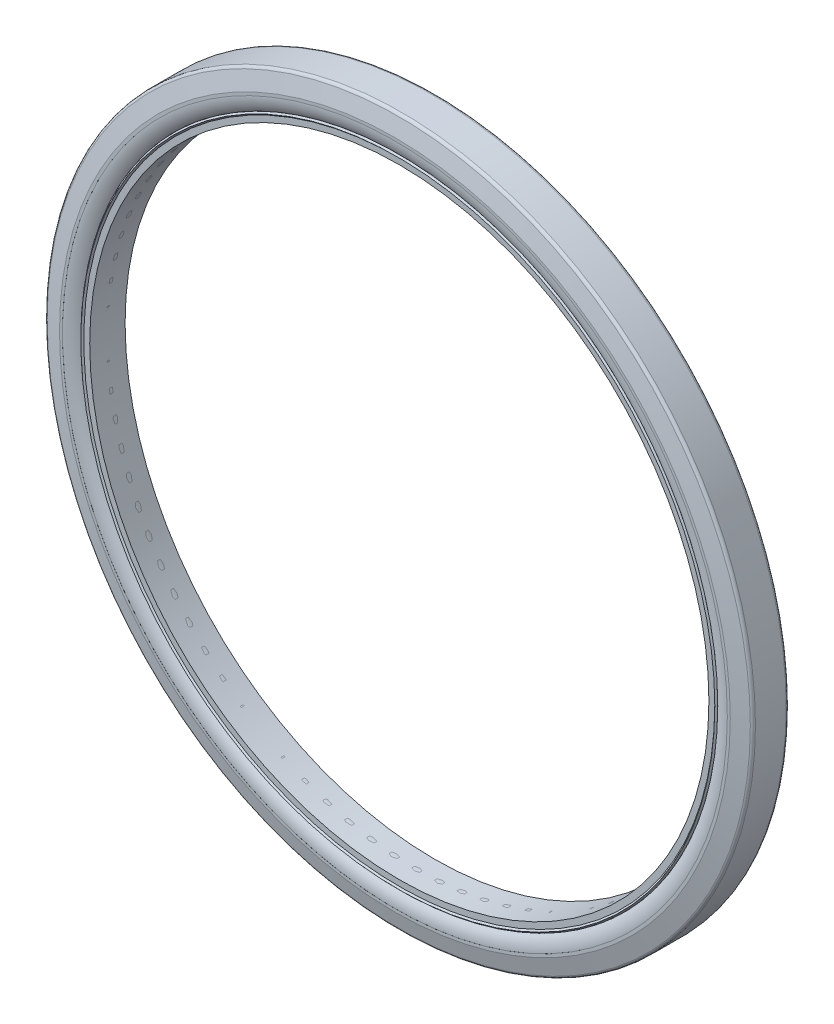
ISO-10303-21;
HEADER;
FILE_DESCRIPTION(('STEP AP214'),'2;1');
FILE_NAME('part.step','',(''),(''),'','','');
FILE_SCHEMA(('AUTOMOTIVE_DESIGN { 1 0 10303 214 1 1 1 1 }'));
ENDSEC;
DATA;
#1=APPLICATION_CONTEXT('core data for automotive mechanical design processes');
#2=APPLICATION_PROTOCOL_DEFINITION('international standard','automotive_design',2000,#1);
#3=PRODUCT_CONTEXT('',#1,'mechanical');
#4=PRODUCT('Part','Part','',(#3));
#5=PRODUCT_RELATED_PRODUCT_CATEGORY('part','',(#4));
#6=PRODUCT_DEFINITION_FORMATION('','',#4);
#7=PRODUCT_DEFINITION_CONTEXT('part definition',#1,'design');
#8=PRODUCT_DEFINITION('design','',#6,#7);
#9=PRODUCT_DEFINITION_SHAPE('','',#8);
#10=(LENGTH_UNIT() NAMED_UNIT(*) SI_UNIT(.MILLI.,.METRE.));
#11=(NAMED_UNIT(*) PLANE_ANGLE_UNIT() SI_UNIT($,.RADIAN.));
#12=(NAMED_UNIT(*) SI_UNIT($,.STERADIAN.) SOLID_ANGLE_UNIT());
#13=UNCERTAINTY_MEASURE_WITH_UNIT(LENGTH_MEASURE(1.E-05),#10,'distance_accuracy_value','');
#14=(GEOMETRIC_REPRESENTATION_CONTEXT(3) GLOBAL_UNCERTAINTY_ASSIGNED_CONTEXT((#13)) GLOBAL_UNIT_ASSIGNED_CONTEXT((#10,
#11,#12)) REPRESENTATION_CONTEXT('',''));
#15=CARTESIAN_POINT('',(0.,0.,0.));
#16=DIRECTION('',(0.,0.,1.));
#17=DIRECTION('',(1.,0.,0.));
#18=AXIS2_PLACEMENT_3D('',#15,#16,#17);
#19=CARTESIAN_POINT('',(0.,22.55,1.2));
#20=DIRECTION('',(0.,0.,-1.));
#21=DIRECTION('',(-1.,0.,0.));
#22=AXIS2_PLACEMENT_3D('',#19,#20,#21);
#23=PLANE('',#22);
#24=CARTESIAN_POINT('',(0.,0.,1.2));
#25=DIRECTION('',(0.,0.,1.));
#26=DIRECTION('',(1.,0.,0.));
#27=AXIS2_PLACEMENT_3D('',#24,#25,#26);
#28=CIRCLE('',#27,21.6);
#29=CARTESIAN_POINT('',(21.6,0.,1.2));
#30=VERTEX_POINT('',#29);
#31=EDGE_CURVE('E109',#30,#30,#28,.T.);
#32=ORIENTED_EDGE('',*,*,#31,.F.);
#33=EDGE_LOOP('',(#32));
#34=FACE_BOUND('',#33,.T.);
#35=CARTESIAN_POINT('',(0.,0.,1.2));
#36=DIRECTION('',(0.,0.,1.));
#37=DIRECTION('',(1.,0.,0.));
#38=AXIS2_PLACEMENT_3D('',#35,#36,#37);
#39=CIRCLE('',#38,22.55);
#40=CARTESIAN_POINT('',(22.55,0.,1.2));
#41=VERTEX_POINT('',#40);
#42=EDGE_CURVE('E11',#41,#41,#39,.T.);
#43=ORIENTED_EDGE('',*,*,#42,.T.);
#44=EDGE_LOOP('',(#43));
#45=FACE_BOUND('',#44,.T.);
#46=ADVANCED_FACE('F51',(#34,#45),#23,.F.);
#47=CARTESIAN_POINT('',(0.,0.,0.));
#48=DIRECTION('',(0.,0.,1.));
#49=DIRECTION('',(1.,0.,0.));
#50=AXIS2_PLACEMENT_3D('',#47,#48,#49);
#51=CYLINDRICAL_SURFACE('',#50,22.55);
#52=ORIENTED_EDGE('',*,*,#42,.F.);
#53=EDGE_LOOP('',(#52));
#54=FACE_BOUND('',#53,.T.);
#55=CARTESIAN_POINT('',(0.,0.,1.5));
#56=DIRECTION('',(0.,0.,1.));
#57=DIRECTION('',(1.,0.,0.));
#58=AXIS2_PLACEMENT_3D('',#55,#56,#57);
#59=CIRCLE('',#58,22.55);
#60=CARTESIAN_POINT('',(22.55,0.,1.5));
#61=VERTEX_POINT('',#60);
#62=EDGE_CURVE('E57',#61,#61,#59,.T.);
#63=ORIENTED_EDGE('',*,*,#62,.T.);
#64=EDGE_LOOP('',(#63));
#65=FACE_BOUND('',#64,.T.);
#66=ADVANCED_FACE('F116',(#54,#65),#51,.F.);
#67=CARTESIAN_POINT('',(0.,22.75,1.5));
#68=DIRECTION('',(0.,0.,-1.));
#69=DIRECTION('',(-1.,0.,0.));
#70=AXIS2_PLACEMENT_3D('',#67,#68,#69);
#71=PLANE('',#70);
#72=ORIENTED_EDGE('',*,*,#62,.F.);
#73=EDGE_LOOP('',(#72));
#74=FACE_BOUND('',#73,.T.);
#75=CARTESIAN_POINT('',(0.,0.,1.5));
#76=DIRECTION('',(0.,0.,1.));
#77=DIRECTION('',(1.,0.,0.));
#78=AXIS2_PLACEMENT_3D('',#75,#76,#77);
#79=CIRCLE('',#78,22.75);
#80=CARTESIAN_POINT('',(22.75,0.,1.5));
#81=VERTEX_POINT('',#80);
#82=EDGE_CURVE('E61',#81,#81,#79,.T.);
#83=ORIENTED_EDGE('',*,*,#82,.T.);
#84=EDGE_LOOP('',(#83));
#85=FACE_BOUND('',#84,.T.);
#86=ADVANCED_FACE('F120',(#74,#85),#71,.F.);
#87=CARTESIAN_POINT('',(0.,0.,1.23679809828118));
#88=DIRECTION('',(0.,0.,-1.));
#89=DIRECTION('',(-1.,0.,0.));
#90=AXIS2_PLACEMENT_3D('',#87,#88,#89);
#91=CONICAL_SURFACE('',#90,23.8466745904951,1.33525134607403);
#92=ORIENTED_EDGE('',*,*,#82,.F.);
#93=EDGE_LOOP('',(#92));
#94=FACE_BOUND('',#93,.T.);
#95=CARTESIAN_POINT('',(0.,0.,1.23679809828118));
#96=DIRECTION('',(0.,0.,1.));
#97=DIRECTION('',(1.,0.,0.));
#98=AXIS2_PLACEMENT_3D('',#95,#96,#97);
#99=CIRCLE('',#98,23.8466745904951);
#100=CARTESIAN_POINT('',(23.8466745904951,0.,1.23679809828118));
#101=VERTEX_POINT('',#100);
#102=EDGE_CURVE('E65',#101,#101,#99,.T.);
#103=ORIENTED_EDGE('',*,*,#102,.T.);
#104=EDGE_LOOP('',(#103));
#105=FACE_BOUND('',#104,.T.);
#106=ADVANCED_FACE('F125',(#94,#105),#91,.T.);
#107=CARTESIAN_POINT('',(0.,0.,1.04232063788508));
#108=DIRECTION('',(0.,0.,1.));
#109=DIRECTION('',(1.,0.,0.));
#110=AXIS2_PLACEMENT_3D('',#107,#108,#109);
#111=TOROIDAL_SURFACE('',#110,23.8,0.2);
#112=ORIENTED_EDGE('',*,*,#102,.F.);
#113=EDGE_LOOP('',(#112));
#114=FACE_BOUND('',#113,.T.);
#115=CARTESIAN_POINT('',(0.,0.,1.04232063788508));
#116=DIRECTION('',(0.,0.,1.));
#117=DIRECTION('',(1.,0.,0.));
#118=AXIS2_PLACEMENT_3D('',#115,#116,#117);
#119=CIRCLE('',#118,24.);
#120=CARTESIAN_POINT('',(24.,0.,1.04232063788508));
#121=VERTEX_POINT('',#120);
#122=EDGE_CURVE('E70',#121,#121,#119,.T.);
#123=ORIENTED_EDGE('',*,*,#122,.T.);
#124=EDGE_LOOP('',(#123));
#125=FACE_BOUND('',#124,.T.);
#126=ADVANCED_FACE('F131',(#114,#125),#111,.T.);
#127=CARTESIAN_POINT('',(0.,0.,0.));
#128=DIRECTION('',(0.,0.,1.));
#129=DIRECTION('',(1.,0.,0.));
#130=AXIS2_PLACEMENT_3D('',#127,#128,#129);
#131=CYLINDRICAL_SURFACE('',#130,24.);
#132=ORIENTED_EDGE('',*,*,#122,.F.);
#133=EDGE_LOOP('',(#132));
#134=FACE_BOUND('',#133,.T.);
#135=CARTESIAN_POINT('',(0.,0.,-1.04232063788508));
#136=DIRECTION('',(0.,0.,1.));
#137=DIRECTION('',(1.,0.,0.));
#138=AXIS2_PLACEMENT_3D('',#135,#136,#137);
#139=CIRCLE('',#138,24.);
#140=CARTESIAN_POINT('',(24.,0.,-1.04232063788508));
#141=VERTEX_POINT('',#140);
#142=EDGE_CURVE('E73',#141,#141,#139,.T.);
#143=ORIENTED_EDGE('',*,*,#142,.T.);
#144=EDGE_LOOP('',(#143));
#145=FACE_BOUND('',#144,.T.);
#146=ADVANCED_FACE('F135',(#134,#145),#131,.T.);
#147=CARTESIAN_POINT('',(0.,0.,-1.04232063788508));
#148=DIRECTION('',(0.,0.,1.));
#149=DIRECTION('',(1.,0.,0.));
#150=AXIS2_PLACEMENT_3D('',#147,#148,#149);
#151=TOROIDAL_SURFACE('',#150,23.8,0.2);
#152=ORIENTED_EDGE('',*,*,#142,.F.);
#153=EDGE_LOOP('',(#152));
#154=FACE_BOUND('',#153,.T.);
#155=CARTESIAN_POINT('',(0.,0.,-1.23679809828118));
#156=DIRECTION('',(0.,0.,1.));
#157=DIRECTION('',(1.,0.,0.));
#158=AXIS2_PLACEMENT_3D('',#155,#156,#157);
#159=CIRCLE('',#158,23.8466745904951);
#160=CARTESIAN_POINT('',(23.8466745904951,0.,-1.23679809828118));
#161=VERTEX_POINT('',#160);
#162=EDGE_CURVE('E76',#161,#161,#159,.T.);
#163=ORIENTED_EDGE('',*,*,#162,.T.);
#164=EDGE_LOOP('',(#163));
#165=FACE_BOUND('',#164,.T.);
#166=ADVANCED_FACE('F139',(#154,#165),#151,.T.);
#167=CARTESIAN_POINT('',(0.,0.,-1.5));
#168=DIRECTION('',(0.,0.,1.));
#169=DIRECTION('',(1.,0.,0.));
#170=AXIS2_PLACEMENT_3D('',#167,#168,#169);
#171=CONICAL_SURFACE('',#170,22.75,1.33525134607403);
#172=ORIENTED_EDGE('',*,*,#162,.F.);
#173=EDGE_LOOP('',(#172));
#174=FACE_BOUND('',#173,.T.);
#175=CARTESIAN_POINT('',(0.,0.,-1.5));
#176=DIRECTION('',(0.,0.,1.));
#177=DIRECTION('',(1.,0.,0.));
#178=AXIS2_PLACEMENT_3D('',#175,#176,#177);
#179=CIRCLE('',#178,22.75);
#180=CARTESIAN_POINT('',(22.75,0.,-1.5));
#181=VERTEX_POINT('',#180);
#182=EDGE_CURVE('E79',#181,#181,#179,.T.);
#183=ORIENTED_EDGE('',*,*,#182,.T.);
#184=EDGE_LOOP('',(#183));
#185=FACE_BOUND('',#184,.T.);
#186=ADVANCED_FACE('F143',(#174,#185),#171,.T.);
#187=CARTESIAN_POINT('',(0.,22.75,-1.5));
#188=DIRECTION('',(0.,0.,1.));
#189=DIRECTION('',(1.,0.,0.));
#190=AXIS2_PLACEMENT_3D('',#187,#188,#189);
#191=PLANE('',#190);
#192=ORIENTED_EDGE('',*,*,#182,.F.);
#193=EDGE_LOOP('',(#192));
#194=FACE_BOUND('',#193,.T.);
#195=CARTESIAN_POINT('',(0.,0.,-1.5));
#196=DIRECTION('',(0.,0.,1.));
#197=DIRECTION('',(1.,0.,0.));
#198=AXIS2_PLACEMENT_3D('',#195,#196,#197);
#199=CIRCLE('',#198,22.55);
#200=CARTESIAN_POINT('',(22.55,0.,-1.5));
#201=VERTEX_POINT('',#200);
#202=EDGE_CURVE('E82',#201,#201,#199,.T.);
#203=ORIENTED_EDGE('',*,*,#202,.T.);
#204=EDGE_LOOP('',(#203));
#205=FACE_BOUND('',#204,.T.);
#206=ADVANCED_FACE('F147',(#194,#205),#191,.F.);
#207=CARTESIAN_POINT('',(0.,0.,0.));
#208=DIRECTION('',(0.,0.,1.));
#209=DIRECTION('',(1.,0.,0.));
#210=AXIS2_PLACEMENT_3D('',#207,#208,#209);
#211=CYLINDRICAL_SURFACE('',#210,22.55);
#212=ORIENTED_EDGE('',*,*,#202,.F.);
#213=EDGE_LOOP('',(#212));
#214=FACE_BOUND('',#213,.T.);
#215=CARTESIAN_POINT('',(0.,0.,-1.2));
#216=DIRECTION('',(0.,0.,1.));
#217=DIRECTION('',(1.,0.,0.));
#218=AXIS2_PLACEMENT_3D('',#215,#216,#217);
#219=CIRCLE('',#218,22.55);
#220=CARTESIAN_POINT('',(22.55,0.,-1.2));
#221=VERTEX_POINT('',#220);
#222=EDGE_CURVE('E85',#221,#221,#219,.T.);
#223=ORIENTED_EDGE('',*,*,#222,.T.);
#224=EDGE_LOOP('',(#223));
#225=FACE_BOUND('',#224,.T.);
#226=ADVANCED_FACE('F151',(#214,#225),#211,.F.);
#227=CARTESIAN_POINT('',(0.,22.55,-1.2));
#228=DIRECTION('',(0.,0.,1.));
#229=DIRECTION('',(1.,0.,0.));
#230=AXIS2_PLACEMENT_3D('',#227,#228,#229);
#231=PLANE('',#230);
#232=ORIENTED_EDGE('',*,*,#222,.F.);
#233=EDGE_LOOP('',(#232));
#234=FACE_BOUND('',#233,.T.);
#235=CARTESIAN_POINT('',(0.,0.,-1.2));
#236=DIRECTION('',(0.,0.,1.));
#237=DIRECTION('',(1.,0.,0.));
#238=AXIS2_PLACEMENT_3D('',#235,#236,#237);
#239=CIRCLE('',#238,21.6);
#240=CARTESIAN_POINT('',(21.6,0.,-1.2));
#241=VERTEX_POINT('',#240);
#242=EDGE_CURVE('E88',#241,#241,#239,.T.);
#243=ORIENTED_EDGE('',*,*,#242,.T.);
#244=EDGE_LOOP('',(#243));
#245=FACE_BOUND('',#244,.T.);
#246=ADVANCED_FACE('F155',(#234,#245),#231,.F.);
#247=CARTESIAN_POINT('',(0.,0.,-1.3));
#248=DIRECTION('',(0.,0.,1.));
#249=DIRECTION('',(1.,0.,0.));
#250=AXIS2_PLACEMENT_3D('',#247,#248,#249);
#251=CONICAL_SURFACE('',#250,21.5,0.785398163397448);
#252=ORIENTED_EDGE('',*,*,#242,.F.);
#253=EDGE_LOOP('',(#252));
#254=FACE_BOUND('',#253,.T.);
#255=CARTESIAN_POINT('',(0.,0.,-1.3));
#256=DIRECTION('',(0.,0.,1.));
#257=DIRECTION('',(1.,0.,0.));
#258=AXIS2_PLACEMENT_3D('',#255,#256,#257);
#259=CIRCLE('',#258,21.5);
#260=CARTESIAN_POINT('',(21.5,0.,-1.3));
#261=VERTEX_POINT('',#260);
#262=EDGE_CURVE('E91',#261,#261,#259,.T.);
#263=ORIENTED_EDGE('',*,*,#262,.T.);
#264=EDGE_LOOP('',(#263));
#265=FACE_BOUND('',#264,.T.);
#266=ADVANCED_FACE('F159',(#254,#265),#251,.T.);
#267=CARTESIAN_POINT('',(0.,0.,-1.2));
#268=DIRECTION('',(0.,0.,-1.));
#269=DIRECTION('',(-1.,0.,0.));
#270=AXIS2_PLACEMENT_3D('',#267,#268,#269);
#271=CONICAL_SURFACE('',#270,21.4,0.785398163397448);
#272=ORIENTED_EDGE('',*,*,#262,.F.);
#273=EDGE_LOOP('',(#272));
#274=FACE_BOUND('',#273,.T.);
#275=CARTESIAN_POINT('',(0.,0.,-1.2));
#276=DIRECTION('',(0.,0.,1.));
#277=DIRECTION('',(1.,0.,0.));
#278=AXIS2_PLACEMENT_3D('',#275,#276,#277);
#279=CIRCLE('',#278,21.4);
#280=CARTESIAN_POINT('',(21.4,0.,-1.2));
#281=VERTEX_POINT('',#280);
#282=EDGE_CURVE('E94',#281,#281,#279,.T.);
#283=ORIENTED_EDGE('',*,*,#282,.T.);
#284=EDGE_LOOP('',(#283));
#285=FACE_BOUND('',#284,.T.);
#286=ADVANCED_FACE('F163',(#274,#285),#271,.F.);
#287=CARTESIAN_POINT('',(0.,21.4,-1.2));
#288=DIRECTION('',(0.,0.,1.));
#289=DIRECTION('',(1.,0.,0.));
#290=AXIS2_PLACEMENT_3D('',#287,#288,#289);
#291=PLANE('',#290);
#292=ORIENTED_EDGE('',*,*,#282,.F.);
#293=EDGE_LOOP('',(#292));
#294=FACE_BOUND('',#293,.T.);
#295=CARTESIAN_POINT('',(0.,0.,-1.2));
#296=DIRECTION('',(0.,0.,1.));
#297=DIRECTION('',(1.,0.,0.));
#298=AXIS2_PLACEMENT_3D('',#295,#296,#297);
#299=CIRCLE('',#298,21.);
#300=CARTESIAN_POINT('',(21.,0.,-1.2));
#301=VERTEX_POINT('',#300);
#302=EDGE_CURVE('E97',#301,#301,#299,.T.);
#303=ORIENTED_EDGE('',*,*,#302,.T.);
#304=EDGE_LOOP('',(#303));
#305=FACE_BOUND('',#304,.T.);
#306=ADVANCED_FACE('F167',(#294,#305),#291,.F.);
#307=CARTESIAN_POINT('',(0.,0.,0.));
#308=DIRECTION('',(0.,0.,1.));
#309=DIRECTION('',(1.,0.,0.));
#310=AXIS2_PLACEMENT_3D('',#307,#308,#309);
#311=CYLINDRICAL_SURFACE('',#310,21.);
#312=ORIENTED_EDGE('',*,*,#302,.F.);
#313=EDGE_LOOP('',(#312));
#314=FACE_BOUND('',#313,.T.);
#315=CARTESIAN_POINT('',(0.,0.,1.2));
#316=DIRECTION('',(0.,0.,1.));
#317=DIRECTION('',(1.,0.,0.));
#318=AXIS2_PLACEMENT_3D('',#315,#316,#317);
#319=CIRCLE('',#318,21.);
#320=CARTESIAN_POINT('',(21.,0.,1.2));
#321=VERTEX_POINT('',#320);
#322=EDGE_CURVE('E100',#321,#321,#319,.T.);
#323=ORIENTED_EDGE('',*,*,#322,.T.);
#324=EDGE_LOOP('',(#323));
#325=FACE_BOUND('',#324,.T.);
#326=ADVANCED_FACE('F171',(#314,#325),#311,.F.);
#327=CARTESIAN_POINT('',(0.,21.4,1.2));
#328=DIRECTION('',(0.,0.,-1.));
#329=DIRECTION('',(-1.,0.,0.));
#330=AXIS2_PLACEMENT_3D('',#327,#328,#329);
#331=PLANE('',#330);
#332=ORIENTED_EDGE('',*,*,#322,.F.);
#333=EDGE_LOOP('',(#332));
#334=FACE_BOUND('',#333,.T.);
#335=CARTESIAN_POINT('',(0.,0.,1.2));
#336=DIRECTION('',(0.,0.,1.));
#337=DIRECTION('',(1.,0.,0.));
#338=AXIS2_PLACEMENT_3D('',#335,#336,#337);
#339=CIRCLE('',#338,21.4);
#340=CARTESIAN_POINT('',(21.4,0.,1.2));
#341=VERTEX_POINT('',#340);
#342=EDGE_CURVE('E103',#341,#341,#339,.T.);
#343=ORIENTED_EDGE('',*,*,#342,.T.);
#344=EDGE_LOOP('',(#343));
#345=FACE_BOUND('',#344,.T.);
#346=ADVANCED_FACE('F175',(#334,#345),#331,.F.);
#347=CARTESIAN_POINT('',(0.,0.,1.3));
#348=DIRECTION('',(0.,0.,1.));
#349=DIRECTION('',(1.,0.,0.));
#350=AXIS2_PLACEMENT_3D('',#347,#348,#349);
#351=CONICAL_SURFACE('',#350,21.5,0.785398163397448);
#352=ORIENTED_EDGE('',*,*,#342,.F.);
#353=EDGE_LOOP('',(#352));
#354=FACE_BOUND('',#353,.T.);
#355=CARTESIAN_POINT('',(0.,0.,1.3));
#356=DIRECTION('',(0.,0.,1.));
#357=DIRECTION('',(1.,0.,0.));
#358=AXIS2_PLACEMENT_3D('',#355,#356,#357);
#359=CIRCLE('',#358,21.5);
#360=CARTESIAN_POINT('',(21.5,0.,1.3));
#361=VERTEX_POINT('',#360);
#362=EDGE_CURVE('E106',#361,#361,#359,.T.);
#363=ORIENTED_EDGE('',*,*,#362,.T.);
#364=EDGE_LOOP('',(#363));
#365=FACE_BOUND('',#364,.T.);
#366=ADVANCED_FACE('F179',(#354,#365),#351,.F.);
#367=CARTESIAN_POINT('',(0.,0.,1.2));
#368=DIRECTION('',(0.,0.,-1.));
#369=DIRECTION('',(-1.,0.,0.));
#370=AXIS2_PLACEMENT_3D('',#367,#368,#369);
#371=CONICAL_SURFACE('',#370,21.6,0.785398163397448);
#372=ORIENTED_EDGE('',*,*,#362,.F.);
#373=EDGE_LOOP('',(#372));
#374=FACE_BOUND('',#373,.T.);
#375=ORIENTED_EDGE('',*,*,#31,.T.);
#376=EDGE_LOOP('',(#375));
#377=FACE_BOUND('',#376,.T.);
#378=ADVANCED_FACE('F113',(#374,#377),#371,.T.);
#379=CLOSED_SHELL('',(#46,#66,#86,#106,#126,#146,#166,#186,#206,#226,#246,#266,#286,#306,#326,
#346,#366,#378));
#380=MANIFOLD_SOLID_BREP('B2',#379);
#381=CARTESIAN_POINT('',(0.,0.,0.));
#382=DIRECTION('',(0.,0.,-1.));
#383=DIRECTION('',(-1.,0.,0.));
#384=AXIS2_PLACEMENT_3D('',#381,#382,#383);
#385=TOROIDAL_SURFACE('',#384,22.5,1.5);
#386=CARTESIAN_POINT('',(-24.,0.,0.));
#387=VERTEX_POINT('',#386);
#388=VERTEX_LOOP('',#387);
#389=FACE_BOUND('',#388,.T.);
#390=ADVANCED_FACE('F323',(#389),#385,.T.);
#391=CLOSED_SHELL('',(#390));
#392=MANIFOLD_SOLID_BREP('B6_NOT_SHOWN',#391);
#393=ADVANCED_BREP_SHAPE_REPRESENTATION('',(#18,#380,#392),#14);
#394=SHAPE_DEFINITION_REPRESENTATION(#9,#393);
ENDSEC;
END-ISO-10303-21;
